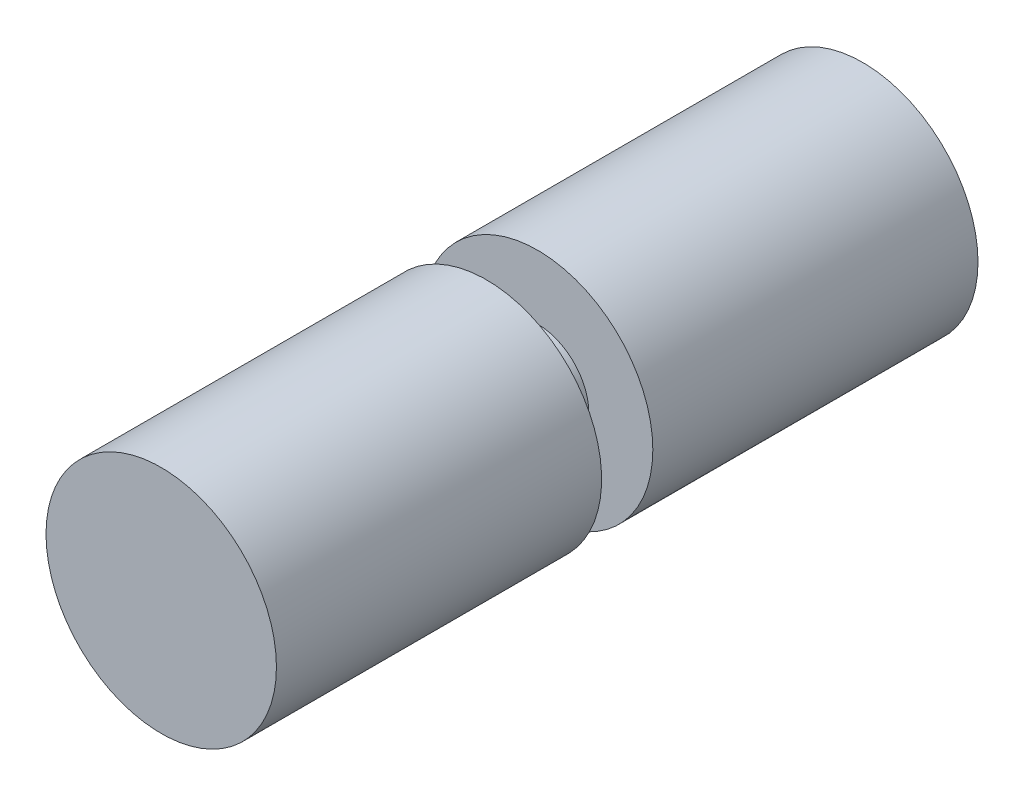
ISO-10303-21;
HEADER;
FILE_DESCRIPTION(('STEP AP214'),'2;1');
FILE_NAME('part.step','',(''),(''),'','','');
FILE_SCHEMA(('AUTOMOTIVE_DESIGN { 1 0 10303 214 1 1 1 1 }'));
ENDSEC;
DATA;
#1=APPLICATION_CONTEXT('core data for automotive mechanical design processes');
#2=APPLICATION_PROTOCOL_DEFINITION('international standard','automotive_design',2000,#1);
#3=PRODUCT_CONTEXT('',#1,'mechanical');
#4=PRODUCT('Part','Part','',(#3));
#5=PRODUCT_RELATED_PRODUCT_CATEGORY('part','',(#4));
#6=PRODUCT_DEFINITION_FORMATION('','',#4);
#7=PRODUCT_DEFINITION_CONTEXT('part definition',#1,'design');
#8=PRODUCT_DEFINITION('design','',#6,#7);
#9=PRODUCT_DEFINITION_SHAPE('','',#8);
#10=(LENGTH_UNIT() NAMED_UNIT(*) SI_UNIT(.MILLI.,.METRE.));
#11=(NAMED_UNIT(*) PLANE_ANGLE_UNIT() SI_UNIT($,.RADIAN.));
#12=(NAMED_UNIT(*) SI_UNIT($,.STERADIAN.) SOLID_ANGLE_UNIT());
#13=UNCERTAINTY_MEASURE_WITH_UNIT(LENGTH_MEASURE(1.E-05),#10,'distance_accuracy_value','');
#14=(GEOMETRIC_REPRESENTATION_CONTEXT(3) GLOBAL_UNCERTAINTY_ASSIGNED_CONTEXT((#13)) GLOBAL_UNIT_ASSIGNED_CONTEXT((#10,
#11,#12)) REPRESENTATION_CONTEXT('',''));
#15=CARTESIAN_POINT('',(0.,0.,0.));
#16=DIRECTION('',(0.,0.,1.));
#17=DIRECTION('',(1.,0.,0.));
#18=AXIS2_PLACEMENT_3D('',#15,#16,#17);
#19=CARTESIAN_POINT('',(0.,0.,71.));
#20=DIRECTION('',(0.,0.,-1.));
#21=DIRECTION('',(-1.,0.,0.));
#22=AXIS2_PLACEMENT_3D('',#19,#20,#21);
#23=CYLINDRICAL_SURFACE('',#22,10.);
#24=CARTESIAN_POINT('',(0.,0.,73.5));
#25=DIRECTION('',(0.,0.,-1.));
#26=DIRECTION('',(-1.,0.,0.));
#27=AXIS2_PLACEMENT_3D('',#24,#25,#26);
#28=CIRCLE('',#27,10.);
#29=CARTESIAN_POINT('',(-10.,0.,73.5));
#30=VERTEX_POINT('',#29);
#31=EDGE_CURVE('E56',#30,#30,#28,.T.);
#32=ORIENTED_EDGE('',*,*,#31,.T.);
#33=EDGE_LOOP('',(#32));
#34=FACE_BOUND('',#33,.T.);
#35=CARTESIAN_POINT('',(0.,0.,63.5));
#36=DIRECTION('',(0.,0.,1.));
#37=DIRECTION('',(1.,0.,0.));
#38=AXIS2_PLACEMENT_3D('',#35,#36,#37);
#39=CIRCLE('',#38,10.);
#40=CARTESIAN_POINT('',(10.,0.,63.5));
#41=VERTEX_POINT('',#40);
#42=EDGE_CURVE('E64',#41,#41,#39,.T.);
#43=ORIENTED_EDGE('',*,*,#42,.T.);
#44=EDGE_LOOP('',(#43));
#45=FACE_BOUND('',#44,.T.);
#46=ADVANCED_FACE('F41',(#34,#45),#23,.T.);
#47=CARTESIAN_POINT('',(0.,0.,73.5));
#48=DIRECTION('',(0.,0.,-1.));
#49=DIRECTION('',(-1.,0.,0.));
#50=AXIS2_PLACEMENT_3D('',#47,#48,#49);
#51=PLANE('',#50);
#52=ORIENTED_EDGE('',*,*,#31,.F.);
#53=EDGE_LOOP('',(#52));
#54=FACE_BOUND('',#53,.T.);
#55=CARTESIAN_POINT('',(0.,0.,73.5));
#56=DIRECTION('',(0.,0.,-1.));
#57=DIRECTION('',(-1.,0.,0.));
#58=AXIS2_PLACEMENT_3D('',#55,#56,#57);
#59=CIRCLE('',#58,22.5);
#60=CARTESIAN_POINT('',(-22.5,0.,73.5));
#61=VERTEX_POINT('',#60);
#62=EDGE_CURVE('E52',#61,#61,#59,.T.);
#63=ORIENTED_EDGE('',*,*,#62,.T.);
#64=EDGE_LOOP('',(#63));
#65=FACE_BOUND('',#64,.T.);
#66=ADVANCED_FACE('F83',(#54,#65),#51,.T.);
#67=CARTESIAN_POINT('',(0.,0.,137.));
#68=DIRECTION('',(0.,0.,1.));
#69=DIRECTION('',(1.,0.,0.));
#70=AXIS2_PLACEMENT_3D('',#67,#68,#69);
#71=PLANE('',#70);
#72=CARTESIAN_POINT('',(0.,0.,137.));
#73=DIRECTION('',(0.,0.,1.));
#74=DIRECTION('',(1.,0.,0.));
#75=AXIS2_PLACEMENT_3D('',#72,#73,#74);
#76=CIRCLE('',#75,22.5);
#77=CARTESIAN_POINT('',(22.5,0.,137.));
#78=VERTEX_POINT('',#77);
#79=EDGE_CURVE('E48',#78,#78,#76,.T.);
#80=ORIENTED_EDGE('',*,*,#79,.T.);
#81=EDGE_LOOP('',(#80));
#82=FACE_BOUND('',#81,.T.);
#83=ADVANCED_FACE('F90',(#82),#71,.T.);
#84=CARTESIAN_POINT('',(0.,0.,137.));
#85=DIRECTION('',(0.,0.,-1.));
#86=DIRECTION('',(-1.,0.,0.));
#87=AXIS2_PLACEMENT_3D('',#84,#85,#86);
#88=CYLINDRICAL_SURFACE('',#87,22.5);
#89=ORIENTED_EDGE('',*,*,#79,.F.);
#90=EDGE_LOOP('',(#89));
#91=FACE_BOUND('',#90,.T.);
#92=ORIENTED_EDGE('',*,*,#62,.F.);
#93=EDGE_LOOP('',(#92));
#94=FACE_BOUND('',#93,.T.);
#95=ADVANCED_FACE('F73',(#91,#94),#88,.T.);
#96=CARTESIAN_POINT('',(0.,0.,63.5));
#97=DIRECTION('',(0.,0.,1.));
#98=DIRECTION('',(1.,0.,0.));
#99=AXIS2_PLACEMENT_3D('',#96,#97,#98);
#100=PLANE('',#99);
#101=ORIENTED_EDGE('',*,*,#42,.F.);
#102=EDGE_LOOP('',(#101));
#103=FACE_BOUND('',#102,.T.);
#104=CARTESIAN_POINT('',(0.,0.,63.5));
#105=DIRECTION('',(0.,0.,1.));
#106=DIRECTION('',(1.,0.,0.));
#107=AXIS2_PLACEMENT_3D('',#104,#105,#106);
#108=CIRCLE('',#107,22.5);
#109=CARTESIAN_POINT('',(22.5,0.,63.5));
#110=VERTEX_POINT('',#109);
#111=EDGE_CURVE('E61',#110,#110,#108,.T.);
#112=ORIENTED_EDGE('',*,*,#111,.T.);
#113=EDGE_LOOP('',(#112));
#114=FACE_BOUND('',#113,.T.);
#115=ADVANCED_FACE('F69',(#103,#114),#100,.T.);
#116=CARTESIAN_POINT('',(0.,0.,0.));
#117=DIRECTION('',(0.,0.,1.));
#118=DIRECTION('',(1.,0.,0.));
#119=AXIS2_PLACEMENT_3D('',#116,#117,#118);
#120=PLANE('',#119);
#121=CARTESIAN_POINT('',(0.,0.,0.));
#122=DIRECTION('',(0.,0.,1.));
#123=DIRECTION('',(1.,0.,0.));
#124=AXIS2_PLACEMENT_3D('',#121,#122,#123);
#125=CIRCLE('',#124,22.5);
#126=CARTESIAN_POINT('',(22.5,0.,0.));
#127=VERTEX_POINT('',#126);
#128=EDGE_CURVE('E10',#127,#127,#125,.T.);
#129=ORIENTED_EDGE('',*,*,#128,.F.);
#130=EDGE_LOOP('',(#129));
#131=FACE_BOUND('',#130,.T.);
#132=ADVANCED_FACE('F72',(#131),#120,.F.);
#133=CARTESIAN_POINT('',(0.,0.,66.));
#134=DIRECTION('',(0.,0.,-1.));
#135=DIRECTION('',(-1.,0.,0.));
#136=AXIS2_PLACEMENT_3D('',#133,#134,#135);
#137=CYLINDRICAL_SURFACE('',#136,22.5);
#138=ORIENTED_EDGE('',*,*,#128,.T.);
#139=EDGE_LOOP('',(#138));
#140=FACE_BOUND('',#139,.T.);
#141=ORIENTED_EDGE('',*,*,#111,.F.);
#142=EDGE_LOOP('',(#141));
#143=FACE_BOUND('',#142,.T.);
#144=ADVANCED_FACE('F43',(#140,#143),#137,.T.);
#145=CLOSED_SHELL('',(#46,#66,#83,#95,#115,#132,#144));
#146=MANIFOLD_SOLID_BREP('B2',#145);
#147=ADVANCED_BREP_SHAPE_REPRESENTATION('',(#18,#146),#14);
#148=SHAPE_DEFINITION_REPRESENTATION(#9,#147);
ENDSEC;
END-ISO-10303-21;
